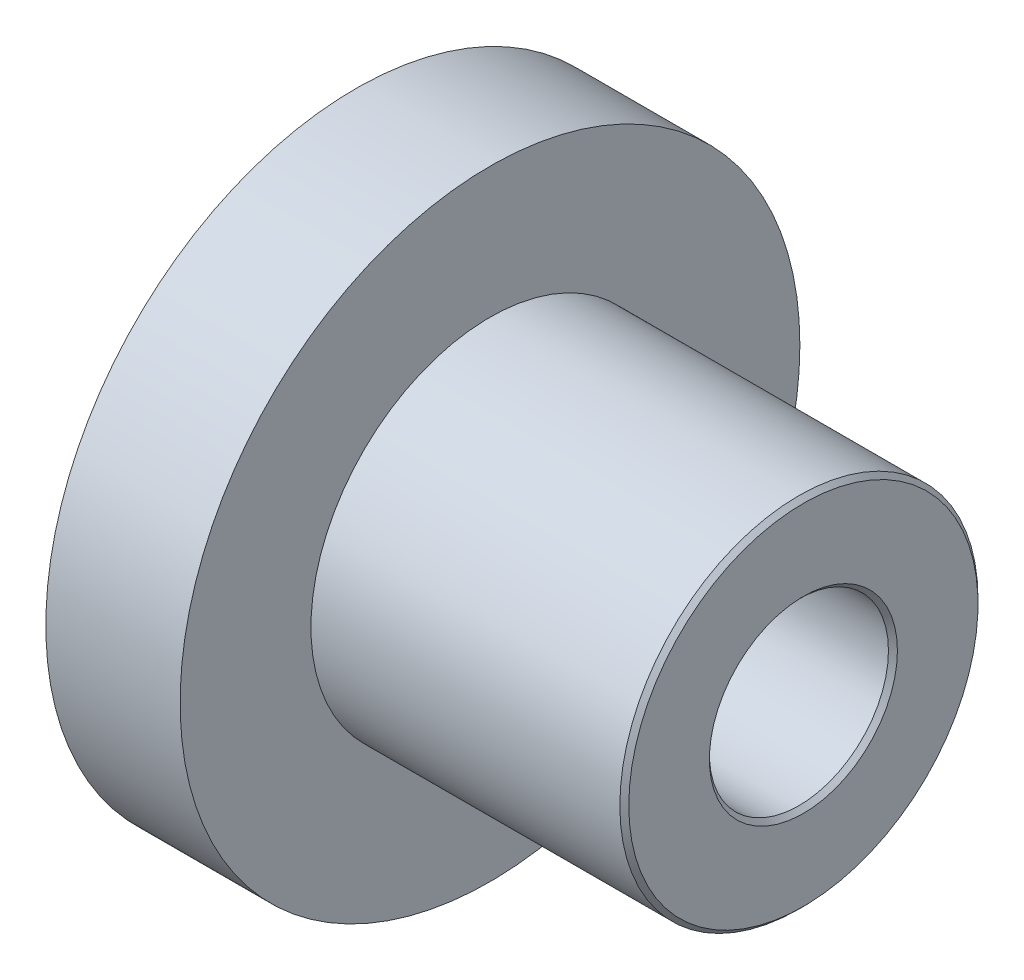
ISO-10303-21;
HEADER;
FILE_DESCRIPTION(('STEP AP214'),'2;1');
FILE_NAME('part.step','',(''),(''),'','','');
FILE_SCHEMA(('AUTOMOTIVE_DESIGN { 1 0 10303 214 1 1 1 1 }'));
ENDSEC;
DATA;
#1=APPLICATION_CONTEXT('core data for automotive mechanical design processes');
#2=APPLICATION_PROTOCOL_DEFINITION('international standard','automotive_design',2000,#1);
#3=PRODUCT_CONTEXT('',#1,'mechanical');
#4=PRODUCT('Part','Part','',(#3));
#5=PRODUCT_RELATED_PRODUCT_CATEGORY('part','',(#4));
#6=PRODUCT_DEFINITION_FORMATION('','',#4);
#7=PRODUCT_DEFINITION_CONTEXT('part definition',#1,'design');
#8=PRODUCT_DEFINITION('design','',#6,#7);
#9=PRODUCT_DEFINITION_SHAPE('','',#8);
#10=(LENGTH_UNIT() NAMED_UNIT(*) SI_UNIT(.MILLI.,.METRE.));
#11=(NAMED_UNIT(*) PLANE_ANGLE_UNIT() SI_UNIT($,.RADIAN.));
#12=(NAMED_UNIT(*) SI_UNIT($,.STERADIAN.) SOLID_ANGLE_UNIT());
#13=UNCERTAINTY_MEASURE_WITH_UNIT(LENGTH_MEASURE(1.E-05),#10,'distance_accuracy_value','');
#14=(GEOMETRIC_REPRESENTATION_CONTEXT(3) GLOBAL_UNCERTAINTY_ASSIGNED_CONTEXT((#13)) GLOBAL_UNIT_ASSIGNED_CONTEXT((#10,
#11,#12)) REPRESENTATION_CONTEXT('',''));
#15=CARTESIAN_POINT('',(0.,0.,0.));
#16=DIRECTION('',(0.,0.,1.));
#17=DIRECTION('',(1.,0.,0.));
#18=AXIS2_PLACEMENT_3D('',#15,#16,#17);
#19=CARTESIAN_POINT('',(-1.5,0.,0.));
#20=DIRECTION('',(1.,0.,0.));
#21=DIRECTION('',(0.,0.,-1.));
#22=AXIS2_PLACEMENT_3D('',#19,#20,#21);
#23=CYLINDRICAL_SURFACE('',#22,6.9215000000081);
#24=CARTESIAN_POINT('',(-1.5,0.,0.));
#25=DIRECTION('',(1.,0.,0.));
#26=DIRECTION('',(0.,0.,-1.));
#27=AXIS2_PLACEMENT_3D('',#24,#25,#26);
#28=CIRCLE('',#27,6.9215000000081);
#29=CARTESIAN_POINT('',(-1.5,0.,-6.9215000000081));
#30=VERTEX_POINT('',#29);
#31=EDGE_CURVE('E62',#30,#30,#28,.T.);
#32=CARTESIAN_POINT('',(1.5,0.,0.));
#33=DIRECTION('',(1.,0.,0.));
#34=DIRECTION('',(0.,0.,-1.));
#35=AXIS2_PLACEMENT_3D('',#32,#33,#34);
#36=CIRCLE('',#35,6.9215000000081);
#37=CARTESIAN_POINT('',(1.5,0.,-6.9215000000081));
#38=VERTEX_POINT('',#37);
#39=EDGE_CURVE('E63',#38,#38,#36,.T.);
#40=CARTESIAN_POINT('',(-1.5,0.,-6.9215000000081));
#41=CARTESIAN_POINT('',(-1.46875,0.,-6.9215000000081));
#42=CARTESIAN_POINT('',(-1.4375,0.,-6.9215000000081));
#43=CARTESIAN_POINT('',(-1.375,0.,-6.9215000000081));
#44=CARTESIAN_POINT('',(-1.34375,0.,-6.9215000000081));
#45=CARTESIAN_POINT('',(-1.28125,0.,-6.9215000000081));
#46=CARTESIAN_POINT('',(-1.25,0.,-6.9215000000081));
#47=CARTESIAN_POINT('',(-1.1875,0.,-6.9215000000081));
#48=CARTESIAN_POINT('',(-1.15625,0.,-6.9215000000081));
#49=CARTESIAN_POINT('',(-1.09375,0.,-6.9215000000081));
#50=CARTESIAN_POINT('',(-1.0625,0.,-6.9215000000081));
#51=CARTESIAN_POINT('',(-1.,0.,-6.9215000000081));
#52=CARTESIAN_POINT('',(-0.968750000000001,0.,-6.9215000000081));
#53=CARTESIAN_POINT('',(-0.90625,0.,-6.9215000000081));
#54=CARTESIAN_POINT('',(-0.875000000000001,0.,-6.9215000000081));
#55=CARTESIAN_POINT('',(-0.812500000000001,0.,-6.9215000000081));
#56=CARTESIAN_POINT('',(-0.78125,0.,-6.9215000000081));
#57=CARTESIAN_POINT('',(-0.71875,0.,-6.9215000000081));
#58=CARTESIAN_POINT('',(-0.6875,0.,-6.9215000000081));
#59=CARTESIAN_POINT('',(-0.625,0.,-6.9215000000081));
#60=CARTESIAN_POINT('',(-0.59375,0.,-6.9215000000081));
#61=CARTESIAN_POINT('',(-0.53125,0.,-6.9215000000081));
#62=CARTESIAN_POINT('',(-0.500000000000001,0.,-6.9215000000081));
#63=CARTESIAN_POINT('',(-0.437500000000001,0.,-6.9215000000081));
#64=CARTESIAN_POINT('',(-0.406250000000001,0.,-6.9215000000081));
#65=CARTESIAN_POINT('',(-0.34375,0.,-6.9215000000081));
#66=CARTESIAN_POINT('',(-0.3125,0.,-6.9215000000081));
#67=CARTESIAN_POINT('',(-0.25,0.,-6.9215000000081));
#68=CARTESIAN_POINT('',(-0.218750000000001,0.,-6.9215000000081));
#69=CARTESIAN_POINT('',(-0.156250000000001,0.,-6.9215000000081));
#70=CARTESIAN_POINT('',(-0.125000000000001,0.,-6.9215000000081));
#71=CARTESIAN_POINT('',(-0.0625000000000005,0.,-6.9215000000081));
#72=CARTESIAN_POINT('',(-0.0312500000000005,0.,-6.9215000000081));
#73=CARTESIAN_POINT('',(0.0312499999999996,0.,-6.9215000000081));
#74=CARTESIAN_POINT('',(0.0624999999999996,0.,-6.9215000000081));
#75=CARTESIAN_POINT('',(0.125,0.,-6.9215000000081));
#76=CARTESIAN_POINT('',(0.15625,0.,-6.9215000000081));
#77=CARTESIAN_POINT('',(0.21875,0.,-6.9215000000081));
#78=CARTESIAN_POINT('',(0.25,0.,-6.9215000000081));
#79=CARTESIAN_POINT('',(0.3125,0.,-6.9215000000081));
#80=CARTESIAN_POINT('',(0.34375,0.,-6.9215000000081));
#81=CARTESIAN_POINT('',(0.40625,0.,-6.9215000000081));
#82=CARTESIAN_POINT('',(0.4375,0.,-6.9215000000081));
#83=CARTESIAN_POINT('',(0.5,0.,-6.9215000000081));
#84=CARTESIAN_POINT('',(0.53125,0.,-6.9215000000081));
#85=CARTESIAN_POINT('',(0.59375,0.,-6.9215000000081));
#86=CARTESIAN_POINT('',(0.625,0.,-6.9215000000081));
#87=CARTESIAN_POINT('',(0.6875,0.,-6.9215000000081));
#88=CARTESIAN_POINT('',(0.71875,0.,-6.9215000000081));
#89=CARTESIAN_POINT('',(0.78125,0.,-6.9215000000081));
#90=CARTESIAN_POINT('',(0.8125,0.,-6.9215000000081));
#91=CARTESIAN_POINT('',(0.875,0.,-6.9215000000081));
#92=CARTESIAN_POINT('',(0.90625,0.,-6.9215000000081));
#93=CARTESIAN_POINT('',(0.96875,0.,-6.9215000000081));
#94=CARTESIAN_POINT('',(1.,0.,-6.9215000000081));
#95=CARTESIAN_POINT('',(1.0625,0.,-6.9215000000081));
#96=CARTESIAN_POINT('',(1.09375,0.,-6.9215000000081));
#97=CARTESIAN_POINT('',(1.15625,0.,-6.9215000000081));
#98=CARTESIAN_POINT('',(1.1875,0.,-6.9215000000081));
#99=CARTESIAN_POINT('',(1.25,0.,-6.9215000000081));
#100=CARTESIAN_POINT('',(1.28125,0.,-6.9215000000081));
#101=CARTESIAN_POINT('',(1.34375,0.,-6.9215000000081));
#102=CARTESIAN_POINT('',(1.375,0.,-6.9215000000081));
#103=CARTESIAN_POINT('',(1.4375,0.,-6.9215000000081));
#104=CARTESIAN_POINT('',(1.46875,0.,-6.9215000000081));
#105=CARTESIAN_POINT('',(1.5,0.,-6.9215000000081));
#106=B_SPLINE_CURVE_WITH_KNOTS('',3,(#40,#41,#42,#43,#44,#45,#46,#47,#48,#49,#50,#51,#52,#53,
#54,#55,#56,#57,#58,#59,#60,#61,#62,#63,#64,#65,#66,#67,#68,#69,#70,#71,#72,#73,#74,#75,#76,#77,
#78,#79,#80,#81,#82,#83,#84,#85,#86,#87,#88,#89,#90,#91,#92,#93,#94,#95,#96,#97,#98,#99,#100,
#101,#102,#103,#104,#105),.UNSPECIFIED.,.F.,.F.,(4,2,2,2,2,2,2,2,2,2,2,2,2,2,2,2,2,2,2,2,2,2,2,
2,2,2,2,2,2,2,2,2,4),(0.,0.0937500000000001,0.1875,0.28125,0.375,0.46875,0.5625,0.65625,0.75,
0.84375,0.9375,1.03125,1.125,1.21875,1.3125,1.40625,1.5,1.59375,1.6875,1.78125,1.875,1.96875,
2.0625,2.15625,2.25,2.34375,2.4375,2.53125,2.625,2.71875,2.8125,2.90625,3.),.UNSPECIFIED.);
#107=EDGE_CURVE('BSEAM33',#30,#38,#106,.T.);
#108=ORIENTED_EDGE('',*,*,#31,.T.);
#109=ORIENTED_EDGE('',*,*,#39,.F.);
#110=ORIENTED_EDGE('',*,*,#107,.T.);
#111=ORIENTED_EDGE('',*,*,#107,.F.);
#112=EDGE_LOOP('',(#108,#110,#109,#111));
#113=FACE_BOUND('',#112,.T.);
#114=ADVANCED_FACE('F33',(#113),#23,.T.);
#115=CARTESIAN_POINT('',(-1.5,0.,0.));
#116=DIRECTION('',(1.,0.,0.));
#117=DIRECTION('',(0.,0.,-1.));
#118=AXIS2_PLACEMENT_3D('',#115,#116,#117);
#119=PLANE('',#118);
#120=CARTESIAN_POINT('',(-1.5,0.,0.));
#121=DIRECTION('',(1.,0.,0.));
#122=DIRECTION('',(0.,0.,-1.));
#123=AXIS2_PLACEMENT_3D('',#120,#121,#122);
#124=CIRCLE('',#123,2.09999999997476);
#125=CARTESIAN_POINT('',(-1.5,0.,-2.09999999997476));
#126=VERTEX_POINT('',#125);
#127=EDGE_CURVE('E10',#126,#126,#124,.T.);
#128=ORIENTED_EDGE('',*,*,#127,.T.);
#129=EDGE_LOOP('',(#128));
#130=FACE_BOUND('',#129,.T.);
#131=ORIENTED_EDGE('',*,*,#31,.F.);
#132=EDGE_LOOP('',(#131));
#133=FACE_BOUND('',#132,.T.);
#134=ADVANCED_FACE('F71',(#130,#133),#119,.F.);
#135=CARTESIAN_POINT('',(1.5,0.,0.));
#136=DIRECTION('',(1.,0.,0.));
#137=DIRECTION('',(0.,0.,-1.));
#138=AXIS2_PLACEMENT_3D('',#135,#136,#137);
#139=PLANE('',#138);
#140=CARTESIAN_POINT('',(1.5,0.,0.));
#141=DIRECTION('',(1.,0.,0.));
#142=DIRECTION('',(0.,0.,-1.));
#143=AXIS2_PLACEMENT_3D('',#140,#141,#142);
#144=CIRCLE('',#143,4.);
#145=CARTESIAN_POINT('',(1.5,0.,-4.));
#146=VERTEX_POINT('',#145);
#147=EDGE_CURVE('E59',#146,#146,#144,.T.);
#148=ORIENTED_EDGE('',*,*,#147,.F.);
#149=EDGE_LOOP('',(#148));
#150=FACE_BOUND('',#149,.T.);
#151=ORIENTED_EDGE('',*,*,#39,.T.);
#152=EDGE_LOOP('',(#151));
#153=FACE_BOUND('',#152,.T.);
#154=ADVANCED_FACE('F73',(#150,#153),#139,.T.);
#155=CARTESIAN_POINT('',(1.5,0.,0.));
#156=DIRECTION('',(1.,0.,0.));
#157=DIRECTION('',(0.,0.,-1.));
#158=AXIS2_PLACEMENT_3D('',#155,#156,#157);
#159=CYLINDRICAL_SURFACE('',#158,4.);
#160=CARTESIAN_POINT('',(8.40000000002523,0.,0.));
#161=DIRECTION('',(1.,0.,0.));
#162=DIRECTION('',(0.,0.,-1.));
#163=AXIS2_PLACEMENT_3D('',#160,#161,#162);
#164=CIRCLE('',#163,4.);
#165=CARTESIAN_POINT('',(8.40000000002523,0.,4.));
#166=VERTEX_POINT('',#165);
#167=EDGE_CURVE('E40',#166,#166,#164,.F.);
#168=ORIENTED_EDGE('',*,*,#167,.T.);
#169=EDGE_LOOP('',(#168));
#170=FACE_BOUND('',#169,.T.);
#171=ORIENTED_EDGE('',*,*,#147,.T.);
#172=EDGE_LOOP('',(#171));
#173=FACE_BOUND('',#172,.T.);
#174=ADVANCED_FACE('F79',(#170,#173),#159,.T.);
#175=CARTESIAN_POINT('',(8.5,0.,0.));
#176=DIRECTION('',(1.,0.,0.));
#177=DIRECTION('',(0.,0.,-1.));
#178=AXIS2_PLACEMENT_3D('',#175,#176,#177);
#179=PLANE('',#178);
#180=CARTESIAN_POINT('',(8.5,0.,0.));
#181=DIRECTION('',(1.,0.,0.));
#182=DIRECTION('',(0.,0.,-1.));
#183=AXIS2_PLACEMENT_3D('',#180,#181,#182);
#184=CIRCLE('',#183,2.10000000003159);
#185=CARTESIAN_POINT('',(8.5,0.,-2.10000000003159));
#186=VERTEX_POINT('',#185);
#187=EDGE_CURVE('E53',#186,#186,#184,.F.);
#188=ORIENTED_EDGE('',*,*,#187,.T.);
#189=EDGE_LOOP('',(#188));
#190=FACE_BOUND('',#189,.T.);
#191=CARTESIAN_POINT('',(8.5,0.,0.));
#192=DIRECTION('',(1.,0.,0.));
#193=DIRECTION('',(0.,0.,-1.));
#194=AXIS2_PLACEMENT_3D('',#191,#192,#193);
#195=CIRCLE('',#194,3.89999999996838);
#196=CARTESIAN_POINT('',(8.5,0.,3.89999999996838));
#197=VERTEX_POINT('',#196);
#198=EDGE_CURVE('E56',#197,#197,#195,.T.);
#199=ORIENTED_EDGE('',*,*,#198,.T.);
#200=EDGE_LOOP('',(#199));
#201=FACE_BOUND('',#200,.T.);
#202=ADVANCED_FACE('F100',(#190,#201),#179,.T.);
#203=CARTESIAN_POINT('',(-1.5,0.,0.));
#204=DIRECTION('',(-1.,0.,0.));
#205=DIRECTION('',(0.,0.,1.));
#206=AXIS2_PLACEMENT_3D('',#203,#204,#205);
#207=CYLINDRICAL_SURFACE('',#206,1.99999999999999);
#208=CARTESIAN_POINT('',(8.40000000002524,0.,0.));
#209=DIRECTION('',(1.,0.,0.));
#210=DIRECTION('',(0.,0.,-1.));
#211=AXIS2_PLACEMENT_3D('',#208,#209,#210);
#212=CIRCLE('',#211,1.99999999999999);
#213=CARTESIAN_POINT('',(8.40000000002524,0.,-1.99999999999999));
#214=VERTEX_POINT('',#213);
#215=EDGE_CURVE('E44',#214,#214,#212,.T.);
#216=ORIENTED_EDGE('',*,*,#215,.T.);
#217=EDGE_LOOP('',(#216));
#218=FACE_BOUND('',#217,.T.);
#219=CARTESIAN_POINT('',(-1.39999999996839,0.,0.));
#220=DIRECTION('',(1.,0.,0.));
#221=DIRECTION('',(0.,0.,-1.));
#222=AXIS2_PLACEMENT_3D('',#219,#220,#221);
#223=CIRCLE('',#222,1.99999999999999);
#224=CARTESIAN_POINT('',(-1.39999999996839,0.,-1.99999999999999));
#225=VERTEX_POINT('',#224);
#226=EDGE_CURVE('E48',#225,#225,#223,.F.);
#227=ORIENTED_EDGE('',*,*,#226,.T.);
#228=EDGE_LOOP('',(#227));
#229=FACE_BOUND('',#228,.T.);
#230=ADVANCED_FACE('F89',(#218,#229),#207,.F.);
#231=CARTESIAN_POINT('',(8.5,0.,0.));
#232=DIRECTION('',(1.,0.,0.));
#233=DIRECTION('',(0.,0.,-1.));
#234=AXIS2_PLACEMENT_3D('',#231,#232,#233);
#235=CONICAL_SURFACE('',#234,2.10000000003159,0.785398163681652);
#236=ORIENTED_EDGE('',*,*,#215,.F.);
#237=EDGE_LOOP('',(#236));
#238=FACE_BOUND('',#237,.T.);
#239=ORIENTED_EDGE('',*,*,#187,.F.);
#240=EDGE_LOOP('',(#239));
#241=FACE_BOUND('',#240,.T.);
#242=ADVANCED_FACE('F86',(#238,#241),#235,.F.);
#243=CARTESIAN_POINT('',(8.5,0.,0.));
#244=DIRECTION('',(-1.,0.,0.));
#245=DIRECTION('',(0.,0.,1.));
#246=AXIS2_PLACEMENT_3D('',#243,#244,#245);
#247=CONICAL_SURFACE('',#246,3.89999999996838,0.785398163681665);
#248=CARTESIAN_POINT('',(8.40000000002523,0.,4.));
#249=CARTESIAN_POINT('',(8.40104166669163,0.,3.998958333333));
#250=CARTESIAN_POINT('',(8.40208333335803,0.,3.99791666666601));
#251=CARTESIAN_POINT('',(8.40416666669084,0.,3.99583333333202));
#252=CARTESIAN_POINT('',(8.40520833335724,0.,3.99479166666502));
#253=CARTESIAN_POINT('',(8.40729166669005,0.,3.99270833333103));
#254=CARTESIAN_POINT('',(8.40833333335646,0.,3.99166666666403));
#255=CARTESIAN_POINT('',(8.41041666668927,0.,3.98958333333004));
#256=CARTESIAN_POINT('',(8.41145833335567,0.,3.98854166666304));
#257=CARTESIAN_POINT('',(8.41354166668848,0.,3.98645833332905));
#258=CARTESIAN_POINT('',(8.41458333335488,0.,3.98541666666206));
#259=CARTESIAN_POINT('',(8.41666666668769,0.,3.98333333332807));
#260=CARTESIAN_POINT('',(8.41770833335409,0.,3.98229166666107));
#261=CARTESIAN_POINT('',(8.4197916666869,0.,3.98020833332708));
#262=CARTESIAN_POINT('',(8.4208333333533,0.,3.97916666666008));
#263=CARTESIAN_POINT('',(8.42291666668611,0.,3.97708333332609));
#264=CARTESIAN_POINT('',(8.42395833335251,0.,3.97604166665909));
#265=CARTESIAN_POINT('',(8.42604166668532,0.,3.9739583333251));
#266=CARTESIAN_POINT('',(8.42708333335173,0.,3.97291666665811));
#267=CARTESIAN_POINT('',(8.42916666668453,0.,3.97083333332411));
#268=CARTESIAN_POINT('',(8.43020833335094,0.,3.96979166665712));
#269=CARTESIAN_POINT('',(8.43229166668375,0.,3.96770833332312));
#270=CARTESIAN_POINT('',(8.43333333335015,0.,3.96666666665613));
#271=CARTESIAN_POINT('',(8.43541666668296,0.,3.96458333332214));
#272=CARTESIAN_POINT('',(8.43645833334936,0.,3.96354166665514));
#273=CARTESIAN_POINT('',(8.43854166668217,0.,3.96145833332115));
#274=CARTESIAN_POINT('',(8.43958333334857,0.,3.96041666665415));
#275=CARTESIAN_POINT('',(8.44166666668138,0.,3.95833333332016));
#276=CARTESIAN_POINT('',(8.44270833334778,0.,3.95729166665316));
#277=CARTESIAN_POINT('',(8.44479166668059,0.,3.95520833331917));
#278=CARTESIAN_POINT('',(8.44583333334699,0.,3.95416666665218));
#279=CARTESIAN_POINT('',(8.4479166666798,0.,3.95208333331818));
#280=CARTESIAN_POINT('',(8.44895833334621,0.,3.95104166665119));
#281=CARTESIAN_POINT('',(8.45104166667902,0.,3.9489583333172));
#282=CARTESIAN_POINT('',(8.45208333334542,0.,3.9479166666502));
#283=CARTESIAN_POINT('',(8.45416666667823,0.,3.94583333331621));
#284=CARTESIAN_POINT('',(8.45520833334463,0.,3.94479166664921));
#285=CARTESIAN_POINT('',(8.45729166667744,0.,3.94270833331522));
#286=CARTESIAN_POINT('',(8.45833333334384,0.,3.94166666664822));
#287=CARTESIAN_POINT('',(8.46041666667665,0.,3.93958333331423));
#288=CARTESIAN_POINT('',(8.46145833334305,0.,3.93854166664724));
#289=CARTESIAN_POINT('',(8.46354166667586,0.,3.93645833331325));
#290=CARTESIAN_POINT('',(8.46458333334227,0.,3.93541666664625));
#291=CARTESIAN_POINT('',(8.46666666667507,0.,3.93333333331226));
#292=CARTESIAN_POINT('',(8.46770833334148,0.,3.93229166664526));
#293=CARTESIAN_POINT('',(8.46979166667429,0.,3.93020833331127));
#294=CARTESIAN_POINT('',(8.47083333334069,0.,3.92916666664427));
#295=CARTESIAN_POINT('',(8.4729166666735,0.,3.92708333331028));
#296=CARTESIAN_POINT('',(8.4739583333399,0.,3.92604166664328));
#297=CARTESIAN_POINT('',(8.47604166667271,0.,3.92395833330929));
#298=CARTESIAN_POINT('',(8.47708333333911,0.,3.9229166666423));
#299=CARTESIAN_POINT('',(8.47916666667192,0.,3.9208333333083));
#300=CARTESIAN_POINT('',(8.48020833333832,0.,3.91979166664131));
#301=CARTESIAN_POINT('',(8.48229166667113,0.,3.91770833330732));
#302=CARTESIAN_POINT('',(8.48333333333754,0.,3.91666666664032));
#303=CARTESIAN_POINT('',(8.48541666667034,0.,3.91458333330633));
#304=CARTESIAN_POINT('',(8.48645833333675,0.,3.91354166663933));
#305=CARTESIAN_POINT('',(8.48854166666955,0.,3.91145833330534));
#306=CARTESIAN_POINT('',(8.48958333333596,0.,3.91041666663835));
#307=CARTESIAN_POINT('',(8.49166666666877,0.,3.90833333330435));
#308=CARTESIAN_POINT('',(8.49270833333517,0.,3.90729166663736));
#309=CARTESIAN_POINT('',(8.49479166666798,0.,3.90520833330336));
#310=CARTESIAN_POINT('',(8.49583333333438,0.,3.90416666663637));
#311=CARTESIAN_POINT('',(8.49791666666719,0.,3.90208333330238));
#312=CARTESIAN_POINT('',(8.49895833333359,0.,3.90104166663538));
#313=CARTESIAN_POINT('',(8.5,0.,3.89999999996838));
#314=B_SPLINE_CURVE_WITH_KNOTS('',3,(#248,#249,#250,#251,#252,#253,#254,#255,#256,#257,#258,
#259,#260,#261,#262,#263,#264,#265,#266,#267,#268,#269,#270,#271,#272,#273,#274,#275,#276,#277,
#278,#279,#280,#281,#282,#283,#284,#285,#286,#287,#288,#289,#290,#291,#292,#293,#294,#295,#296,
#297,#298,#299,#300,#301,#302,#303,#304,#305,#306,#307,#308,#309,#310,#311,#312,#313),
.UNSPECIFIED.,.F.,.F.,(4,2,2,2,2,2,2,2,2,2,2,2,2,2,2,2,2,2,2,2,2,2,2,2,2,2,2,2,2,2,2,2,4),(0.,
0.00441941738255588,0.00883883476511361,0.0132582521476713,0.0176776695302284,
0.0220970869127843,0.0265165042953421,0.0309359216778998,0.0353553390604569,0.0397747564430128,
0.0441941738255705,0.0486135912081282,0.0530330085906853,0.0574524259732412,0.0618718433557989,
0.0662912607383567,0.0707106781209138,0.0751300955034697,0.0795495128860274,0.0839689302685851,
0.0883883476511422,0.0928077650336981,0.0972271824162558,0.101646599798814,0.106066017181371,
0.110485434563927,0.114904851946484,0.119324269329042,0.123743686711599,0.128163104094155,
0.132582521476713,0.13700193885927,0.141421356241828),.UNSPECIFIED.);
#315=EDGE_CURVE('BSEAM88',#166,#197,#314,.T.);
#316=ORIENTED_EDGE('',*,*,#167,.F.);
#317=ORIENTED_EDGE('',*,*,#198,.F.);
#318=ORIENTED_EDGE('',*,*,#315,.T.);
#319=ORIENTED_EDGE('',*,*,#315,.F.);
#320=EDGE_LOOP('',(#316,#318,#317,#319));
#321=FACE_BOUND('',#320,.T.);
#322=ADVANCED_FACE('F88',(#321),#247,.T.);
#323=CARTESIAN_POINT('',(-1.39999999996839,0.,0.));
#324=DIRECTION('',(-1.,0.,0.));
#325=DIRECTION('',(0.,0.,1.));
#326=AXIS2_PLACEMENT_3D('',#323,#324,#325);
#327=CONICAL_SURFACE('',#326,1.99999999999999,0.785398163113246);
#328=ORIENTED_EDGE('',*,*,#127,.F.);
#329=EDGE_LOOP('',(#328));
#330=FACE_BOUND('',#329,.T.);
#331=ORIENTED_EDGE('',*,*,#226,.F.);
#332=EDGE_LOOP('',(#331));
#333=FACE_BOUND('',#332,.T.);
#334=ADVANCED_FACE('F35',(#330,#333),#327,.F.);
#335=CLOSED_SHELL('',(#114,#134,#154,#174,#202,#230,#242,#322,#334));
#336=MANIFOLD_SOLID_BREP('B2',#335);
#337=ADVANCED_BREP_SHAPE_REPRESENTATION('',(#18,#336),#14);
#338=SHAPE_DEFINITION_REPRESENTATION(#9,#337);
ENDSEC;
END-ISO-10303-21;
